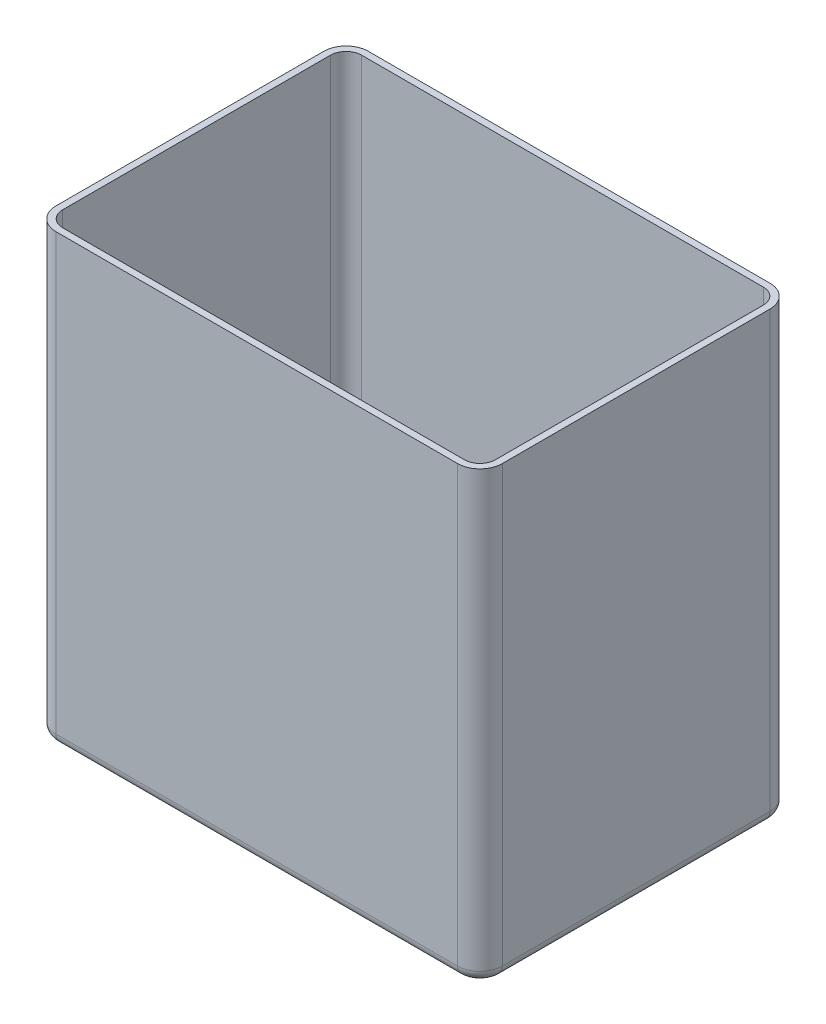
ISO-10303-21;
HEADER;
FILE_DESCRIPTION(('STEP AP214'),'2;1');
FILE_NAME('part.step','',(''),(''),'','','');
FILE_SCHEMA(('AUTOMOTIVE_DESIGN { 1 0 10303 214 1 1 1 1 }'));
ENDSEC;
DATA;
#1=APPLICATION_CONTEXT('core data for automotive mechanical design processes');
#2=APPLICATION_PROTOCOL_DEFINITION('international standard','automotive_design',2000,#1);
#3=PRODUCT_CONTEXT('',#1,'mechanical');
#4=PRODUCT('Part','Part','',(#3));
#5=PRODUCT_RELATED_PRODUCT_CATEGORY('part','',(#4));
#6=PRODUCT_DEFINITION_FORMATION('','',#4);
#7=PRODUCT_DEFINITION_CONTEXT('part definition',#1,'design');
#8=PRODUCT_DEFINITION('design','',#6,#7);
#9=PRODUCT_DEFINITION_SHAPE('','',#8);
#10=(LENGTH_UNIT() NAMED_UNIT(*) SI_UNIT(.MILLI.,.METRE.));
#11=(NAMED_UNIT(*) PLANE_ANGLE_UNIT() SI_UNIT($,.RADIAN.));
#12=(NAMED_UNIT(*) SI_UNIT($,.STERADIAN.) SOLID_ANGLE_UNIT());
#13=UNCERTAINTY_MEASURE_WITH_UNIT(LENGTH_MEASURE(1.E-05),#10,'distance_accuracy_value','');
#14=(GEOMETRIC_REPRESENTATION_CONTEXT(3) GLOBAL_UNCERTAINTY_ASSIGNED_CONTEXT((#13)) GLOBAL_UNIT_ASSIGNED_CONTEXT((#10,
#11,#12)) REPRESENTATION_CONTEXT('',''));
#15=CARTESIAN_POINT('',(0.,0.,0.));
#16=DIRECTION('',(0.,0.,1.));
#17=DIRECTION('',(1.,0.,0.));
#18=AXIS2_PLACEMENT_3D('',#15,#16,#17);
#19=CARTESIAN_POINT('',(-100.,-200.,70.));
#20=DIRECTION('',(-1.,0.,0.));
#21=DIRECTION('',(0.,0.,1.));
#22=AXIS2_PLACEMENT_3D('',#19,#20,#21);
#23=PLANE('',#22);
#24=DIRECTION('',(0.,1.,0.));
#25=VECTOR('',#24,1.);
#26=CARTESIAN_POINT('',(-100.,-200.,-60.));
#27=LINE('',#26,#25);
#28=CARTESIAN_POINT('',(-100.,0.,-60.));
#29=VERTEX_POINT('',#28);
#30=CARTESIAN_POINT('',(-100.,-195.,-60.));
#31=VERTEX_POINT('',#30);
#32=EDGE_CURVE('E321',#29,#31,#27,.F.);
#33=ORIENTED_EDGE('',*,*,#32,.T.);
#34=DIRECTION('',(0.,0.,1.));
#35=VECTOR('',#34,1.);
#36=CARTESIAN_POINT('',(-100.,-195.,60.));
#37=LINE('',#36,#35);
#38=CARTESIAN_POINT('',(-100.,-195.,60.));
#39=VERTEX_POINT('',#38);
#40=EDGE_CURVE('E376',#31,#39,#37,.T.);
#41=ORIENTED_EDGE('',*,*,#40,.T.);
#42=DIRECTION('',(0.,1.,0.));
#43=VECTOR('',#42,1.);
#44=CARTESIAN_POINT('',(-100.,-200.,60.));
#45=LINE('',#44,#43);
#46=CARTESIAN_POINT('',(-100.,0.,60.));
#47=VERTEX_POINT('',#46);
#48=EDGE_CURVE('E324',#39,#47,#45,.T.);
#49=ORIENTED_EDGE('',*,*,#48,.T.);
#50=DIRECTION('',(0.,0.,1.));
#51=VECTOR('',#50,1.);
#52=CARTESIAN_POINT('',(-100.,0.,70.));
#53=LINE('',#52,#51);
#54=EDGE_CURVE('E309',#29,#47,#53,.T.);
#55=ORIENTED_EDGE('',*,*,#54,.F.);
#56=EDGE_LOOP('',(#33,#41,#49,#55));
#57=FACE_BOUND('',#56,.T.);
#58=ADVANCED_FACE('F33',(#57),#23,.T.);
#59=CARTESIAN_POINT('',(100.,-200.,-70.));
#60=DIRECTION('',(0.,0.,-1.));
#61=DIRECTION('',(-1.,0.,0.));
#62=AXIS2_PLACEMENT_3D('',#59,#60,#61);
#63=PLANE('',#62);
#64=DIRECTION('',(0.,1.,0.));
#65=VECTOR('',#64,1.);
#66=CARTESIAN_POINT('',(90.,-200.,-70.));
#67=LINE('',#66,#65);
#68=CARTESIAN_POINT('',(90.,0.,-70.));
#69=VERTEX_POINT('',#68);
#70=CARTESIAN_POINT('',(90.,-195.,-70.));
#71=VERTEX_POINT('',#70);
#72=EDGE_CURVE('E338',#69,#71,#67,.F.);
#73=ORIENTED_EDGE('',*,*,#72,.T.);
#74=DIRECTION('',(-1.,0.,0.));
#75=VECTOR('',#74,1.);
#76=CARTESIAN_POINT('',(-90.,-195.,-70.));
#77=LINE('',#76,#75);
#78=CARTESIAN_POINT('',(-90.,-195.,-70.));
#79=VERTEX_POINT('',#78);
#80=EDGE_CURVE('E372',#71,#79,#77,.T.);
#81=ORIENTED_EDGE('',*,*,#80,.T.);
#82=DIRECTION('',(0.,1.,0.));
#83=VECTOR('',#82,1.);
#84=CARTESIAN_POINT('',(-90.,-200.,-70.));
#85=LINE('',#84,#83);
#86=CARTESIAN_POINT('',(-90.,0.,-70.));
#87=VERTEX_POINT('',#86);
#88=EDGE_CURVE('E341',#79,#87,#85,.T.);
#89=ORIENTED_EDGE('',*,*,#88,.T.);
#90=DIRECTION('',(-1.,0.,0.));
#91=VECTOR('',#90,1.);
#92=CARTESIAN_POINT('',(100.,0.,-70.));
#93=LINE('',#92,#91);
#94=EDGE_CURVE('E318',#69,#87,#93,.T.);
#95=ORIENTED_EDGE('',*,*,#94,.F.);
#96=EDGE_LOOP('',(#73,#81,#89,#95));
#97=FACE_BOUND('',#96,.T.);
#98=ADVANCED_FACE('F424',(#97),#63,.T.);
#99=CARTESIAN_POINT('',(100.,-200.,70.));
#100=DIRECTION('',(1.,0.,0.));
#101=DIRECTION('',(0.,0.,-1.));
#102=AXIS2_PLACEMENT_3D('',#99,#100,#101);
#103=PLANE('',#102);
#104=DIRECTION('',(0.,1.,0.));
#105=VECTOR('',#104,1.);
#106=CARTESIAN_POINT('',(100.,-200.,60.));
#107=LINE('',#106,#105);
#108=CARTESIAN_POINT('',(100.,0.,60.));
#109=VERTEX_POINT('',#108);
#110=CARTESIAN_POINT('',(100.,-195.,60.));
#111=VERTEX_POINT('',#110);
#112=EDGE_CURVE('E345',#109,#111,#107,.F.);
#113=ORIENTED_EDGE('',*,*,#112,.T.);
#114=DIRECTION('',(0.,0.,-1.));
#115=VECTOR('',#114,1.);
#116=CARTESIAN_POINT('',(100.,-195.,-60.));
#117=LINE('',#116,#115);
#118=CARTESIAN_POINT('',(100.,-195.,-60.));
#119=VERTEX_POINT('',#118);
#120=EDGE_CURVE('E368',#111,#119,#117,.T.);
#121=ORIENTED_EDGE('',*,*,#120,.T.);
#122=DIRECTION('',(0.,1.,0.));
#123=VECTOR('',#122,1.);
#124=CARTESIAN_POINT('',(100.,-200.,-60.));
#125=LINE('',#124,#123);
#126=CARTESIAN_POINT('',(100.,0.,-60.));
#127=VERTEX_POINT('',#126);
#128=EDGE_CURVE('E343',#119,#127,#125,.T.);
#129=ORIENTED_EDGE('',*,*,#128,.T.);
#130=DIRECTION('',(0.,0.,-1.));
#131=VECTOR('',#130,1.);
#132=CARTESIAN_POINT('',(100.,0.,70.));
#133=LINE('',#132,#131);
#134=EDGE_CURVE('E315',#109,#127,#133,.T.);
#135=ORIENTED_EDGE('',*,*,#134,.F.);
#136=EDGE_LOOP('',(#113,#121,#129,#135));
#137=FACE_BOUND('',#136,.T.);
#138=ADVANCED_FACE('F477',(#137),#103,.T.);
#139=CARTESIAN_POINT('',(100.,-200.,70.));
#140=DIRECTION('',(0.,0.,1.));
#141=DIRECTION('',(1.,0.,0.));
#142=AXIS2_PLACEMENT_3D('',#139,#140,#141);
#143=PLANE('',#142);
#144=DIRECTION('',(0.,1.,0.));
#145=VECTOR('',#144,1.);
#146=CARTESIAN_POINT('',(-90.,-200.,70.));
#147=LINE('',#146,#145);
#148=CARTESIAN_POINT('',(-90.,0.,70.));
#149=VERTEX_POINT('',#148);
#150=CARTESIAN_POINT('',(-90.,-195.,70.));
#151=VERTEX_POINT('',#150);
#152=EDGE_CURVE('E336',#149,#151,#147,.F.);
#153=ORIENTED_EDGE('',*,*,#152,.T.);
#154=DIRECTION('',(1.,0.,0.));
#155=VECTOR('',#154,1.);
#156=CARTESIAN_POINT('',(90.,-195.,70.));
#157=LINE('',#156,#155);
#158=CARTESIAN_POINT('',(90.,-195.,70.));
#159=VERTEX_POINT('',#158);
#160=EDGE_CURVE('E11',#151,#159,#157,.T.);
#161=ORIENTED_EDGE('',*,*,#160,.T.);
#162=DIRECTION('',(0.,1.,0.));
#163=VECTOR('',#162,1.);
#164=CARTESIAN_POINT('',(90.,-200.,70.));
#165=LINE('',#164,#163);
#166=CARTESIAN_POINT('',(90.,0.,70.));
#167=VERTEX_POINT('',#166);
#168=EDGE_CURVE('E334',#159,#167,#165,.T.);
#169=ORIENTED_EDGE('',*,*,#168,.T.);
#170=DIRECTION('',(1.,0.,0.));
#171=VECTOR('',#170,1.);
#172=CARTESIAN_POINT('',(100.,0.,70.));
#173=LINE('',#172,#171);
#174=EDGE_CURVE('E312',#149,#167,#173,.T.);
#175=ORIENTED_EDGE('',*,*,#174,.F.);
#176=EDGE_LOOP('',(#153,#161,#169,#175));
#177=FACE_BOUND('',#176,.T.);
#178=ADVANCED_FACE('F454',(#177),#143,.T.);
#179=CARTESIAN_POINT('',(-100.,-200.,-70.));
#180=DIRECTION('',(0.,1.,0.));
#181=DIRECTION('',(0.,0.,1.));
#182=AXIS2_PLACEMENT_3D('',#179,#180,#181);
#183=PLANE('',#182);
#184=DIRECTION('',(0.,0.,-1.));
#185=VECTOR('',#184,1.);
#186=CARTESIAN_POINT('',(95.,-200.,60.));
#187=LINE('',#186,#185);
#188=CARTESIAN_POINT('',(95.,-200.,-60.));
#189=VERTEX_POINT('',#188);
#190=CARTESIAN_POINT('',(95.,-200.,60.));
#191=VERTEX_POINT('',#190);
#192=EDGE_CURVE('E360',#189,#191,#187,.F.);
#193=ORIENTED_EDGE('',*,*,#192,.T.);
#194=CARTESIAN_POINT('',(90.,-200.,60.));
#195=DIRECTION('',(0.,1.,0.));
#196=DIRECTION('',(0.,0.,1.));
#197=AXIS2_PLACEMENT_3D('',#194,#195,#196);
#198=CIRCLE('',#197,5.);
#199=CARTESIAN_POINT('',(90.,-200.,65.));
#200=VERTEX_POINT('',#199);
#201=EDGE_CURVE('E362',#191,#200,#198,.F.);
#202=ORIENTED_EDGE('',*,*,#201,.T.);
#203=DIRECTION('',(1.,0.,0.));
#204=VECTOR('',#203,1.);
#205=CARTESIAN_POINT('',(-90.,-200.,65.));
#206=LINE('',#205,#204);
#207=CARTESIAN_POINT('',(-90.,-200.,65.));
#208=VERTEX_POINT('',#207);
#209=EDGE_CURVE('E348',#200,#208,#206,.F.);
#210=ORIENTED_EDGE('',*,*,#209,.T.);
#211=CARTESIAN_POINT('',(-90.,-200.,60.));
#212=DIRECTION('',(0.,1.,0.));
#213=DIRECTION('',(0.,0.,1.));
#214=AXIS2_PLACEMENT_3D('',#211,#212,#213);
#215=CIRCLE('',#214,5.);
#216=CARTESIAN_POINT('',(-95.,-200.,60.));
#217=VERTEX_POINT('',#216);
#218=EDGE_CURVE('E350',#208,#217,#215,.F.);
#219=ORIENTED_EDGE('',*,*,#218,.T.);
#220=DIRECTION('',(0.,0.,1.));
#221=VECTOR('',#220,1.);
#222=CARTESIAN_POINT('',(-95.,-200.,-60.));
#223=LINE('',#222,#221);
#224=CARTESIAN_POINT('',(-95.,-200.,-60.));
#225=VERTEX_POINT('',#224);
#226=EDGE_CURVE('E352',#217,#225,#223,.F.);
#227=ORIENTED_EDGE('',*,*,#226,.T.);
#228=CARTESIAN_POINT('',(-90.,-200.,-60.));
#229=DIRECTION('',(0.,1.,0.));
#230=DIRECTION('',(0.,0.,1.));
#231=AXIS2_PLACEMENT_3D('',#228,#229,#230);
#232=CIRCLE('',#231,5.);
#233=CARTESIAN_POINT('',(-90.,-200.,-65.));
#234=VERTEX_POINT('',#233);
#235=EDGE_CURVE('E354',#225,#234,#232,.F.);
#236=ORIENTED_EDGE('',*,*,#235,.T.);
#237=DIRECTION('',(-1.,0.,0.));
#238=VECTOR('',#237,1.);
#239=CARTESIAN_POINT('',(90.,-200.,-65.));
#240=LINE('',#239,#238);
#241=CARTESIAN_POINT('',(90.,-200.,-65.));
#242=VERTEX_POINT('',#241);
#243=EDGE_CURVE('E356',#234,#242,#240,.F.);
#244=ORIENTED_EDGE('',*,*,#243,.T.);
#245=CARTESIAN_POINT('',(90.,-200.,-60.));
#246=DIRECTION('',(0.,1.,0.));
#247=DIRECTION('',(0.,0.,1.));
#248=AXIS2_PLACEMENT_3D('',#245,#246,#247);
#249=CIRCLE('',#248,5.);
#250=EDGE_CURVE('E358',#242,#189,#249,.F.);
#251=ORIENTED_EDGE('',*,*,#250,.T.);
#252=EDGE_LOOP('',(#193,#202,#210,#219,#227,#236,#244,#251));
#253=FACE_BOUND('',#252,.T.);
#254=ADVANCED_FACE('F440',(#253),#183,.F.);
#255=CARTESIAN_POINT('',(-100.,0.,-70.));
#256=DIRECTION('',(0.,1.,0.));
#257=DIRECTION('',(0.,0.,1.));
#258=AXIS2_PLACEMENT_3D('',#255,#256,#257);
#259=PLANE('',#258);
#260=DIRECTION('',(0.,0.,1.));
#261=VECTOR('',#260,1.);
#262=CARTESIAN_POINT('',(-97.,0.,-70.));
#263=LINE('',#262,#261);
#264=CARTESIAN_POINT('',(-97.,0.,-60.));
#265=VERTEX_POINT('',#264);
#266=CARTESIAN_POINT('',(-97.,0.,60.));
#267=VERTEX_POINT('',#266);
#268=EDGE_CURVE('E215',#265,#267,#263,.T.);
#269=ORIENTED_EDGE('',*,*,#268,.F.);
#270=CARTESIAN_POINT('',(-90.,0.,-60.));
#271=DIRECTION('',(0.,1.,0.));
#272=DIRECTION('',(0.,0.,1.));
#273=AXIS2_PLACEMENT_3D('',#270,#271,#272);
#274=CIRCLE('',#273,7.);
#275=CARTESIAN_POINT('',(-90.,0.,-67.));
#276=VERTEX_POINT('',#275);
#277=EDGE_CURVE('E298',#276,#265,#274,.T.);
#278=ORIENTED_EDGE('',*,*,#277,.F.);
#279=DIRECTION('',(-1.,0.,0.));
#280=VECTOR('',#279,1.);
#281=CARTESIAN_POINT('',(-100.,0.,-67.));
#282=LINE('',#281,#280);
#283=CARTESIAN_POINT('',(90.,0.,-67.));
#284=VERTEX_POINT('',#283);
#285=EDGE_CURVE('E50',#284,#276,#282,.T.);
#286=ORIENTED_EDGE('',*,*,#285,.F.);
#287=CARTESIAN_POINT('',(90.,0.,-60.));
#288=DIRECTION('',(0.,1.,0.));
#289=DIRECTION('',(0.,0.,1.));
#290=AXIS2_PLACEMENT_3D('',#287,#288,#289);
#291=CIRCLE('',#290,7.);
#292=CARTESIAN_POINT('',(97.,0.,-60.));
#293=VERTEX_POINT('',#292);
#294=EDGE_CURVE('E219',#293,#284,#291,.T.);
#295=ORIENTED_EDGE('',*,*,#294,.F.);
#296=DIRECTION('',(0.,0.,-1.));
#297=VECTOR('',#296,1.);
#298=CARTESIAN_POINT('',(97.,0.,-70.));
#299=LINE('',#298,#297);
#300=CARTESIAN_POINT('',(97.,0.,60.));
#301=VERTEX_POINT('',#300);
#302=EDGE_CURVE('E301',#301,#293,#299,.T.);
#303=ORIENTED_EDGE('',*,*,#302,.F.);
#304=CARTESIAN_POINT('',(90.,0.,60.));
#305=DIRECTION('',(0.,1.,0.));
#306=DIRECTION('',(0.,0.,1.));
#307=AXIS2_PLACEMENT_3D('',#304,#305,#306);
#308=CIRCLE('',#307,7.);
#309=CARTESIAN_POINT('',(90.,0.,67.));
#310=VERTEX_POINT('',#309);
#311=EDGE_CURVE('E302',#310,#301,#308,.T.);
#312=ORIENTED_EDGE('',*,*,#311,.F.);
#313=DIRECTION('',(1.,0.,0.));
#314=VECTOR('',#313,1.);
#315=CARTESIAN_POINT('',(-100.,0.,67.));
#316=LINE('',#315,#314);
#317=CARTESIAN_POINT('',(-90.,0.,67.));
#318=VERTEX_POINT('',#317);
#319=EDGE_CURVE('E296',#318,#310,#316,.T.);
#320=ORIENTED_EDGE('',*,*,#319,.F.);
#321=CARTESIAN_POINT('',(-90.,0.,60.));
#322=DIRECTION('',(0.,1.,0.));
#323=DIRECTION('',(0.,0.,1.));
#324=AXIS2_PLACEMENT_3D('',#321,#322,#323);
#325=CIRCLE('',#324,7.);
#326=EDGE_CURVE('E245',#267,#318,#325,.T.);
#327=ORIENTED_EDGE('',*,*,#326,.F.);
#328=EDGE_LOOP('',(#269,#278,#286,#295,#303,#312,#320,#327));
#329=FACE_BOUND('',#328,.T.);
#330=ORIENTED_EDGE('',*,*,#54,.T.);
#331=CARTESIAN_POINT('',(-90.,0.,60.));
#332=DIRECTION('',(0.,1.,0.));
#333=DIRECTION('',(0.,0.,1.));
#334=AXIS2_PLACEMENT_3D('',#331,#332,#333);
#335=CIRCLE('',#334,10.);
#336=EDGE_CURVE('E332',#47,#149,#335,.T.);
#337=ORIENTED_EDGE('',*,*,#336,.T.);
#338=ORIENTED_EDGE('',*,*,#174,.T.);
#339=CARTESIAN_POINT('',(90.,0.,60.));
#340=DIRECTION('',(0.,1.,0.));
#341=DIRECTION('',(0.,0.,1.));
#342=AXIS2_PLACEMENT_3D('',#339,#340,#341);
#343=CIRCLE('',#342,10.);
#344=EDGE_CURVE('E328',#167,#109,#343,.T.);
#345=ORIENTED_EDGE('',*,*,#344,.T.);
#346=ORIENTED_EDGE('',*,*,#134,.T.);
#347=CARTESIAN_POINT('',(90.,0.,-60.));
#348=DIRECTION('',(0.,1.,0.));
#349=DIRECTION('',(0.,0.,1.));
#350=AXIS2_PLACEMENT_3D('',#347,#348,#349);
#351=CIRCLE('',#350,10.);
#352=EDGE_CURVE('E326',#127,#69,#351,.T.);
#353=ORIENTED_EDGE('',*,*,#352,.T.);
#354=ORIENTED_EDGE('',*,*,#94,.T.);
#355=CARTESIAN_POINT('',(-90.,0.,-60.));
#356=DIRECTION('',(0.,1.,0.));
#357=DIRECTION('',(0.,0.,1.));
#358=AXIS2_PLACEMENT_3D('',#355,#356,#357);
#359=CIRCLE('',#358,10.);
#360=EDGE_CURVE('E330',#87,#29,#359,.T.);
#361=ORIENTED_EDGE('',*,*,#360,.T.);
#362=EDGE_LOOP('',(#330,#337,#338,#345,#346,#353,#354,#361));
#363=FACE_BOUND('',#362,.T.);
#364=ADVANCED_FACE('F418',(#329,#363),#259,.T.);
#365=CARTESIAN_POINT('',(-90.,-200.,60.));
#366=DIRECTION('',(0.,1.,0.));
#367=DIRECTION('',(0.,0.,1.));
#368=AXIS2_PLACEMENT_3D('',#365,#366,#367);
#369=CYLINDRICAL_SURFACE('',#368,10.);
#370=ORIENTED_EDGE('',*,*,#48,.F.);
#371=CARTESIAN_POINT('',(-90.,-195.,60.));
#372=DIRECTION('',(0.,1.,0.));
#373=DIRECTION('',(0.,0.,1.));
#374=AXIS2_PLACEMENT_3D('',#371,#372,#373);
#375=CIRCLE('',#374,10.);
#376=EDGE_CURVE('E42',#39,#151,#375,.T.);
#377=ORIENTED_EDGE('',*,*,#376,.T.);
#378=ORIENTED_EDGE('',*,*,#152,.F.);
#379=ORIENTED_EDGE('',*,*,#336,.F.);
#380=EDGE_LOOP('',(#370,#377,#378,#379));
#381=FACE_BOUND('',#380,.T.);
#382=ADVANCED_FACE('F482',(#381),#369,.T.);
#383=CARTESIAN_POINT('',(-90.,-200.,-60.));
#384=DIRECTION('',(0.,1.,0.));
#385=DIRECTION('',(0.,0.,1.));
#386=AXIS2_PLACEMENT_3D('',#383,#384,#385);
#387=CYLINDRICAL_SURFACE('',#386,10.);
#388=ORIENTED_EDGE('',*,*,#88,.F.);
#389=CARTESIAN_POINT('',(-90.,-195.,-60.));
#390=DIRECTION('',(0.,1.,0.));
#391=DIRECTION('',(0.,0.,1.));
#392=AXIS2_PLACEMENT_3D('',#389,#390,#391);
#393=CIRCLE('',#392,10.);
#394=EDGE_CURVE('E374',#79,#31,#393,.T.);
#395=ORIENTED_EDGE('',*,*,#394,.T.);
#396=ORIENTED_EDGE('',*,*,#32,.F.);
#397=ORIENTED_EDGE('',*,*,#360,.F.);
#398=EDGE_LOOP('',(#388,#395,#396,#397));
#399=FACE_BOUND('',#398,.T.);
#400=ADVANCED_FACE('F412',(#399),#387,.T.);
#401=CARTESIAN_POINT('',(90.,-200.,60.));
#402=DIRECTION('',(0.,1.,0.));
#403=DIRECTION('',(0.,0.,1.));
#404=AXIS2_PLACEMENT_3D('',#401,#402,#403);
#405=CYLINDRICAL_SURFACE('',#404,10.);
#406=ORIENTED_EDGE('',*,*,#168,.F.);
#407=CARTESIAN_POINT('',(90.,-195.,60.));
#408=DIRECTION('',(0.,1.,0.));
#409=DIRECTION('',(0.,0.,1.));
#410=AXIS2_PLACEMENT_3D('',#407,#408,#409);
#411=CIRCLE('',#410,10.);
#412=EDGE_CURVE('E365',#159,#111,#411,.T.);
#413=ORIENTED_EDGE('',*,*,#412,.T.);
#414=ORIENTED_EDGE('',*,*,#112,.F.);
#415=ORIENTED_EDGE('',*,*,#344,.F.);
#416=EDGE_LOOP('',(#406,#413,#414,#415));
#417=FACE_BOUND('',#416,.T.);
#418=ADVANCED_FACE('F458',(#417),#405,.T.);
#419=CARTESIAN_POINT('',(90.,-200.,-60.));
#420=DIRECTION('',(0.,1.,0.));
#421=DIRECTION('',(0.,0.,1.));
#422=AXIS2_PLACEMENT_3D('',#419,#420,#421);
#423=CYLINDRICAL_SURFACE('',#422,10.);
#424=ORIENTED_EDGE('',*,*,#128,.F.);
#425=CARTESIAN_POINT('',(90.,-195.,-60.));
#426=DIRECTION('',(0.,1.,0.));
#427=DIRECTION('',(0.,0.,1.));
#428=AXIS2_PLACEMENT_3D('',#425,#426,#427);
#429=CIRCLE('',#428,10.);
#430=EDGE_CURVE('E370',#119,#71,#429,.T.);
#431=ORIENTED_EDGE('',*,*,#430,.T.);
#432=ORIENTED_EDGE('',*,*,#72,.F.);
#433=ORIENTED_EDGE('',*,*,#352,.F.);
#434=EDGE_LOOP('',(#424,#431,#432,#433));
#435=FACE_BOUND('',#434,.T.);
#436=ADVANCED_FACE('F427',(#435),#423,.T.);
#437=CARTESIAN_POINT('',(-90.,-195.,-60.));
#438=DIRECTION('',(0.,1.,0.));
#439=DIRECTION('',(0.,0.,1.));
#440=AXIS2_PLACEMENT_3D('',#437,#438,#439);
#441=DEGENERATE_TOROIDAL_SURFACE('',#440,5.,5.,.T.);
#442=CARTESIAN_POINT('',(-95.,-195.,-60.));
#443=DIRECTION('',(0.,0.,1.));
#444=DIRECTION('',(1.,0.,0.));
#445=AXIS2_PLACEMENT_3D('',#442,#443,#444);
#446=CIRCLE('',#445,5.);
#447=EDGE_CURVE('E393',#31,#225,#446,.T.);
#448=ORIENTED_EDGE('',*,*,#447,.F.);
#449=ORIENTED_EDGE('',*,*,#394,.F.);
#450=CARTESIAN_POINT('',(-90.,-195.,-65.));
#451=DIRECTION('',(1.,0.,0.));
#452=DIRECTION('',(0.,0.,-1.));
#453=AXIS2_PLACEMENT_3D('',#450,#451,#452);
#454=CIRCLE('',#453,5.);
#455=EDGE_CURVE('E37',#234,#79,#454,.T.);
#456=ORIENTED_EDGE('',*,*,#455,.F.);
#457=ORIENTED_EDGE('',*,*,#235,.F.);
#458=EDGE_LOOP('',(#448,#449,#456,#457));
#459=FACE_BOUND('',#458,.T.);
#460=ADVANCED_FACE('F35',(#459),#441,.T.);
#461=CARTESIAN_POINT('',(100.,-195.,-65.));
#462=DIRECTION('',(1.,0.,0.));
#463=DIRECTION('',(0.,0.,-1.));
#464=AXIS2_PLACEMENT_3D('',#461,#462,#463);
#465=CYLINDRICAL_SURFACE('',#464,5.);
#466=ORIENTED_EDGE('',*,*,#455,.T.);
#467=ORIENTED_EDGE('',*,*,#80,.F.);
#468=CARTESIAN_POINT('',(90.,-195.,-65.));
#469=DIRECTION('',(1.,0.,0.));
#470=DIRECTION('',(0.,0.,-1.));
#471=AXIS2_PLACEMENT_3D('',#468,#469,#470);
#472=CIRCLE('',#471,5.);
#473=EDGE_CURVE('E391',#242,#71,#472,.T.);
#474=ORIENTED_EDGE('',*,*,#473,.F.);
#475=ORIENTED_EDGE('',*,*,#243,.F.);
#476=EDGE_LOOP('',(#466,#467,#474,#475));
#477=FACE_BOUND('',#476,.T.);
#478=ADVANCED_FACE('F404',(#477),#465,.T.);
#479=CARTESIAN_POINT('',(-95.,-195.,70.));
#480=DIRECTION('',(0.,0.,-1.));
#481=DIRECTION('',(-1.,0.,0.));
#482=AXIS2_PLACEMENT_3D('',#479,#480,#481);
#483=CYLINDRICAL_SURFACE('',#482,5.);
#484=ORIENTED_EDGE('',*,*,#447,.T.);
#485=ORIENTED_EDGE('',*,*,#226,.F.);
#486=CARTESIAN_POINT('',(-95.,-195.,60.));
#487=DIRECTION('',(0.,0.,1.));
#488=DIRECTION('',(1.,0.,0.));
#489=AXIS2_PLACEMENT_3D('',#486,#487,#488);
#490=CIRCLE('',#489,5.);
#491=EDGE_CURVE('E388',#39,#217,#490,.T.);
#492=ORIENTED_EDGE('',*,*,#491,.F.);
#493=ORIENTED_EDGE('',*,*,#40,.F.);
#494=EDGE_LOOP('',(#484,#485,#492,#493));
#495=FACE_BOUND('',#494,.T.);
#496=ADVANCED_FACE('F443',(#495),#483,.T.);
#497=CARTESIAN_POINT('',(90.,-195.,-60.));
#498=DIRECTION('',(0.,1.,0.));
#499=DIRECTION('',(0.,0.,1.));
#500=AXIS2_PLACEMENT_3D('',#497,#498,#499);
#501=DEGENERATE_TOROIDAL_SURFACE('',#500,5.,5.,.T.);
#502=ORIENTED_EDGE('',*,*,#473,.T.);
#503=ORIENTED_EDGE('',*,*,#430,.F.);
#504=CARTESIAN_POINT('',(95.,-195.,-60.));
#505=DIRECTION('',(0.,0.,1.));
#506=DIRECTION('',(1.,0.,0.));
#507=AXIS2_PLACEMENT_3D('',#504,#505,#506);
#508=CIRCLE('',#507,5.);
#509=EDGE_CURVE('E385',#189,#119,#508,.T.);
#510=ORIENTED_EDGE('',*,*,#509,.F.);
#511=ORIENTED_EDGE('',*,*,#250,.F.);
#512=EDGE_LOOP('',(#502,#503,#510,#511));
#513=FACE_BOUND('',#512,.T.);
#514=ADVANCED_FACE('F431',(#513),#501,.T.);
#515=CARTESIAN_POINT('',(-90.,-195.,60.));
#516=DIRECTION('',(0.,1.,0.));
#517=DIRECTION('',(0.,0.,1.));
#518=AXIS2_PLACEMENT_3D('',#515,#516,#517);
#519=DEGENERATE_TOROIDAL_SURFACE('',#518,5.,5.,.T.);
#520=ORIENTED_EDGE('',*,*,#491,.T.);
#521=ORIENTED_EDGE('',*,*,#218,.F.);
#522=CARTESIAN_POINT('',(-90.,-195.,65.));
#523=DIRECTION('',(1.,0.,0.));
#524=DIRECTION('',(0.,0.,-1.));
#525=AXIS2_PLACEMENT_3D('',#522,#523,#524);
#526=CIRCLE('',#525,5.);
#527=EDGE_CURVE('E382',#151,#208,#526,.T.);
#528=ORIENTED_EDGE('',*,*,#527,.F.);
#529=ORIENTED_EDGE('',*,*,#376,.F.);
#530=EDGE_LOOP('',(#520,#521,#528,#529));
#531=FACE_BOUND('',#530,.T.);
#532=ADVANCED_FACE('F445',(#531),#519,.T.);
#533=CARTESIAN_POINT('',(95.,-195.,70.));
#534=DIRECTION('',(0.,0.,1.));
#535=DIRECTION('',(1.,0.,0.));
#536=AXIS2_PLACEMENT_3D('',#533,#534,#535);
#537=CYLINDRICAL_SURFACE('',#536,5.);
#538=ORIENTED_EDGE('',*,*,#509,.T.);
#539=ORIENTED_EDGE('',*,*,#120,.F.);
#540=CARTESIAN_POINT('',(95.,-195.,60.));
#541=DIRECTION('',(0.,0.,1.));
#542=DIRECTION('',(1.,0.,0.));
#543=AXIS2_PLACEMENT_3D('',#540,#541,#542);
#544=CIRCLE('',#543,5.);
#545=EDGE_CURVE('E380',#191,#111,#544,.T.);
#546=ORIENTED_EDGE('',*,*,#545,.F.);
#547=ORIENTED_EDGE('',*,*,#192,.F.);
#548=EDGE_LOOP('',(#538,#539,#546,#547));
#549=FACE_BOUND('',#548,.T.);
#550=ADVANCED_FACE('F436',(#549),#537,.T.);
#551=CARTESIAN_POINT('',(100.,-195.,65.));
#552=DIRECTION('',(-1.,0.,0.));
#553=DIRECTION('',(0.,0.,1.));
#554=AXIS2_PLACEMENT_3D('',#551,#552,#553);
#555=CYLINDRICAL_SURFACE('',#554,5.);
#556=ORIENTED_EDGE('',*,*,#527,.T.);
#557=ORIENTED_EDGE('',*,*,#209,.F.);
#558=CARTESIAN_POINT('',(90.,-195.,65.));
#559=DIRECTION('',(1.,0.,0.));
#560=DIRECTION('',(0.,0.,-1.));
#561=AXIS2_PLACEMENT_3D('',#558,#559,#560);
#562=CIRCLE('',#561,5.);
#563=EDGE_CURVE('E238',#159,#200,#562,.T.);
#564=ORIENTED_EDGE('',*,*,#563,.F.);
#565=ORIENTED_EDGE('',*,*,#160,.F.);
#566=EDGE_LOOP('',(#556,#557,#564,#565));
#567=FACE_BOUND('',#566,.T.);
#568=ADVANCED_FACE('F451',(#567),#555,.T.);
#569=CARTESIAN_POINT('',(90.,-195.,60.));
#570=DIRECTION('',(0.,1.,0.));
#571=DIRECTION('',(0.,0.,1.));
#572=AXIS2_PLACEMENT_3D('',#569,#570,#571);
#573=DEGENERATE_TOROIDAL_SURFACE('',#572,5.,5.,.T.);
#574=ORIENTED_EDGE('',*,*,#545,.T.);
#575=ORIENTED_EDGE('',*,*,#412,.F.);
#576=ORIENTED_EDGE('',*,*,#563,.T.);
#577=ORIENTED_EDGE('',*,*,#201,.F.);
#578=EDGE_LOOP('',(#574,#575,#576,#577));
#579=FACE_BOUND('',#578,.T.);
#580=ADVANCED_FACE('F461',(#579),#573,.T.);
#581=CARTESIAN_POINT('',(-97.,-200.,70.));
#582=DIRECTION('',(-1.,0.,0.));
#583=DIRECTION('',(0.,0.,1.));
#584=AXIS2_PLACEMENT_3D('',#581,#582,#583);
#585=PLANE('',#584);
#586=DIRECTION('',(0.,1.,0.));
#587=VECTOR('',#586,1.);
#588=CARTESIAN_POINT('',(-97.,-200.,-60.));
#589=LINE('',#588,#587);
#590=CARTESIAN_POINT('',(-97.,-195.,-60.));
#591=VERTEX_POINT('',#590);
#592=EDGE_CURVE('E220',#265,#591,#589,.F.);
#593=ORIENTED_EDGE('',*,*,#592,.F.);
#594=ORIENTED_EDGE('',*,*,#268,.T.);
#595=DIRECTION('',(0.,1.,0.));
#596=VECTOR('',#595,1.);
#597=CARTESIAN_POINT('',(-97.,-200.,60.));
#598=LINE('',#597,#596);
#599=CARTESIAN_POINT('',(-97.,-195.,60.));
#600=VERTEX_POINT('',#599);
#601=EDGE_CURVE('E212',#600,#267,#598,.T.);
#602=ORIENTED_EDGE('',*,*,#601,.F.);
#603=DIRECTION('',(0.,0.,1.));
#604=VECTOR('',#603,1.);
#605=CARTESIAN_POINT('',(-97.,-195.,70.));
#606=LINE('',#605,#604);
#607=EDGE_CURVE('E199',#591,#600,#606,.T.);
#608=ORIENTED_EDGE('',*,*,#607,.F.);
#609=EDGE_LOOP('',(#593,#594,#602,#608));
#610=FACE_BOUND('',#609,.T.);
#611=ADVANCED_FACE('F213',(#610),#585,.F.);
#612=CARTESIAN_POINT('',(100.,-200.,-67.));
#613=DIRECTION('',(0.,0.,-1.));
#614=DIRECTION('',(-1.,0.,0.));
#615=AXIS2_PLACEMENT_3D('',#612,#613,#614);
#616=PLANE('',#615);
#617=DIRECTION('',(0.,1.,0.));
#618=VECTOR('',#617,1.);
#619=CARTESIAN_POINT('',(90.,-200.,-67.));
#620=LINE('',#619,#618);
#621=CARTESIAN_POINT('',(90.,-195.,-67.));
#622=VERTEX_POINT('',#621);
#623=EDGE_CURVE('E241',#284,#622,#620,.F.);
#624=ORIENTED_EDGE('',*,*,#623,.F.);
#625=ORIENTED_EDGE('',*,*,#285,.T.);
#626=DIRECTION('',(0.,1.,0.));
#627=VECTOR('',#626,1.);
#628=CARTESIAN_POINT('',(-90.,-200.,-67.));
#629=LINE('',#628,#627);
#630=CARTESIAN_POINT('',(-90.,-195.,-67.));
#631=VERTEX_POINT('',#630);
#632=EDGE_CURVE('E259',#631,#276,#629,.T.);
#633=ORIENTED_EDGE('',*,*,#632,.F.);
#634=DIRECTION('',(-1.,0.,0.));
#635=VECTOR('',#634,1.);
#636=CARTESIAN_POINT('',(100.,-195.,-67.));
#637=LINE('',#636,#635);
#638=EDGE_CURVE('E261',#622,#631,#637,.T.);
#639=ORIENTED_EDGE('',*,*,#638,.F.);
#640=EDGE_LOOP('',(#624,#625,#633,#639));
#641=FACE_BOUND('',#640,.T.);
#642=ADVANCED_FACE('F468',(#641),#616,.F.);
#643=CARTESIAN_POINT('',(97.,-200.,70.));
#644=DIRECTION('',(1.,0.,0.));
#645=DIRECTION('',(0.,0.,-1.));
#646=AXIS2_PLACEMENT_3D('',#643,#644,#645);
#647=PLANE('',#646);
#648=DIRECTION('',(0.,1.,0.));
#649=VECTOR('',#648,1.);
#650=CARTESIAN_POINT('',(97.,-200.,60.));
#651=LINE('',#650,#649);
#652=CARTESIAN_POINT('',(97.,-195.,60.));
#653=VERTEX_POINT('',#652);
#654=EDGE_CURVE('E251',#301,#653,#651,.F.);
#655=ORIENTED_EDGE('',*,*,#654,.F.);
#656=ORIENTED_EDGE('',*,*,#302,.T.);
#657=DIRECTION('',(0.,1.,0.));
#658=VECTOR('',#657,1.);
#659=CARTESIAN_POINT('',(97.,-200.,-60.));
#660=LINE('',#659,#658);
#661=CARTESIAN_POINT('',(97.,-195.,-60.));
#662=VERTEX_POINT('',#661);
#663=EDGE_CURVE('E255',#662,#293,#660,.T.);
#664=ORIENTED_EDGE('',*,*,#663,.F.);
#665=DIRECTION('',(0.,0.,-1.));
#666=VECTOR('',#665,1.);
#667=CARTESIAN_POINT('',(97.,-195.,70.));
#668=LINE('',#667,#666);
#669=EDGE_CURVE('E249',#653,#662,#668,.T.);
#670=ORIENTED_EDGE('',*,*,#669,.F.);
#671=EDGE_LOOP('',(#655,#656,#664,#670));
#672=FACE_BOUND('',#671,.T.);
#673=ADVANCED_FACE('F545',(#672),#647,.F.);
#674=CARTESIAN_POINT('',(100.,-200.,67.));
#675=DIRECTION('',(0.,0.,1.));
#676=DIRECTION('',(1.,0.,0.));
#677=AXIS2_PLACEMENT_3D('',#674,#675,#676);
#678=PLANE('',#677);
#679=DIRECTION('',(0.,1.,0.));
#680=VECTOR('',#679,1.);
#681=CARTESIAN_POINT('',(-90.,-200.,67.));
#682=LINE('',#681,#680);
#683=CARTESIAN_POINT('',(-90.,-195.,67.));
#684=VERTEX_POINT('',#683);
#685=EDGE_CURVE('E234',#318,#684,#682,.F.);
#686=ORIENTED_EDGE('',*,*,#685,.F.);
#687=ORIENTED_EDGE('',*,*,#319,.T.);
#688=DIRECTION('',(0.,1.,0.));
#689=VECTOR('',#688,1.);
#690=CARTESIAN_POINT('',(90.,-200.,67.));
#691=LINE('',#690,#689);
#692=CARTESIAN_POINT('',(90.,-195.,67.));
#693=VERTEX_POINT('',#692);
#694=EDGE_CURVE('E242',#693,#310,#691,.T.);
#695=ORIENTED_EDGE('',*,*,#694,.F.);
#696=DIRECTION('',(1.,0.,0.));
#697=VECTOR('',#696,1.);
#698=CARTESIAN_POINT('',(100.,-195.,67.));
#699=LINE('',#698,#697);
#700=EDGE_CURVE('E236',#684,#693,#699,.T.);
#701=ORIENTED_EDGE('',*,*,#700,.F.);
#702=EDGE_LOOP('',(#686,#687,#695,#701));
#703=FACE_BOUND('',#702,.T.);
#704=ADVANCED_FACE('F554',(#703),#678,.F.);
#705=CARTESIAN_POINT('',(-100.,-197.,-70.));
#706=DIRECTION('',(0.,1.,0.));
#707=DIRECTION('',(0.,0.,1.));
#708=AXIS2_PLACEMENT_3D('',#705,#706,#707);
#709=PLANE('',#708);
#710=DIRECTION('',(0.,0.,1.));
#711=VECTOR('',#710,1.);
#712=CARTESIAN_POINT('',(95.,-197.,-70.));
#713=LINE('',#712,#711);
#714=CARTESIAN_POINT('',(95.,-197.,-60.));
#715=VERTEX_POINT('',#714);
#716=CARTESIAN_POINT('',(95.,-197.,60.));
#717=VERTEX_POINT('',#716);
#718=EDGE_CURVE('E275',#715,#717,#713,.T.);
#719=ORIENTED_EDGE('',*,*,#718,.F.);
#720=CARTESIAN_POINT('',(90.,-197.,-60.));
#721=DIRECTION('',(0.,1.,0.));
#722=DIRECTION('',(0.,0.,1.));
#723=AXIS2_PLACEMENT_3D('',#720,#721,#722);
#724=CIRCLE('',#723,5.);
#725=CARTESIAN_POINT('',(90.,-197.,-65.));
#726=VERTEX_POINT('',#725);
#727=EDGE_CURVE('E277',#726,#715,#724,.F.);
#728=ORIENTED_EDGE('',*,*,#727,.F.);
#729=DIRECTION('',(1.,0.,0.));
#730=VECTOR('',#729,1.);
#731=CARTESIAN_POINT('',(-100.,-197.,-65.));
#732=LINE('',#731,#730);
#733=CARTESIAN_POINT('',(-90.,-197.,-65.));
#734=VERTEX_POINT('',#733);
#735=EDGE_CURVE('E273',#734,#726,#732,.T.);
#736=ORIENTED_EDGE('',*,*,#735,.F.);
#737=CARTESIAN_POINT('',(-90.,-197.,-60.));
#738=DIRECTION('',(0.,1.,0.));
#739=DIRECTION('',(0.,0.,1.));
#740=AXIS2_PLACEMENT_3D('',#737,#738,#739);
#741=CIRCLE('',#740,5.);
#742=CARTESIAN_POINT('',(-95.,-197.,-60.));
#743=VERTEX_POINT('',#742);
#744=EDGE_CURVE('E271',#743,#734,#741,.F.);
#745=ORIENTED_EDGE('',*,*,#744,.F.);
#746=DIRECTION('',(0.,0.,1.));
#747=VECTOR('',#746,1.);
#748=CARTESIAN_POINT('',(-95.,-197.,-70.));
#749=LINE('',#748,#747);
#750=CARTESIAN_POINT('',(-95.,-197.,60.));
#751=VERTEX_POINT('',#750);
#752=EDGE_CURVE('E274',#751,#743,#749,.F.);
#753=ORIENTED_EDGE('',*,*,#752,.F.);
#754=CARTESIAN_POINT('',(-90.,-197.,60.));
#755=DIRECTION('',(0.,1.,0.));
#756=DIRECTION('',(0.,0.,1.));
#757=AXIS2_PLACEMENT_3D('',#754,#755,#756);
#758=CIRCLE('',#757,5.);
#759=CARTESIAN_POINT('',(-90.,-197.,65.));
#760=VERTEX_POINT('',#759);
#761=EDGE_CURVE('E227',#760,#751,#758,.F.);
#762=ORIENTED_EDGE('',*,*,#761,.F.);
#763=DIRECTION('',(1.,0.,0.));
#764=VECTOR('',#763,1.);
#765=CARTESIAN_POINT('',(-100.,-197.,65.));
#766=LINE('',#765,#764);
#767=CARTESIAN_POINT('',(90.,-197.,65.));
#768=VERTEX_POINT('',#767);
#769=EDGE_CURVE('E254',#768,#760,#766,.F.);
#770=ORIENTED_EDGE('',*,*,#769,.F.);
#771=CARTESIAN_POINT('',(90.,-197.,60.));
#772=DIRECTION('',(0.,1.,0.));
#773=DIRECTION('',(0.,0.,1.));
#774=AXIS2_PLACEMENT_3D('',#771,#772,#773);
#775=CIRCLE('',#774,5.);
#776=EDGE_CURVE('E250',#717,#768,#775,.F.);
#777=ORIENTED_EDGE('',*,*,#776,.F.);
#778=EDGE_LOOP('',(#719,#728,#736,#745,#753,#762,#770,#777));
#779=FACE_BOUND('',#778,.T.);
#780=ADVANCED_FACE('F564',(#779),#709,.T.);
#781=CARTESIAN_POINT('',(-90.,-200.,60.));
#782=DIRECTION('',(0.,1.,0.));
#783=DIRECTION('',(0.,0.,1.));
#784=AXIS2_PLACEMENT_3D('',#781,#782,#783);
#785=CYLINDRICAL_SURFACE('',#784,7.);
#786=ORIENTED_EDGE('',*,*,#601,.T.);
#787=ORIENTED_EDGE('',*,*,#326,.T.);
#788=ORIENTED_EDGE('',*,*,#685,.T.);
#789=CARTESIAN_POINT('',(-90.,-195.,60.));
#790=DIRECTION('',(0.,1.,0.));
#791=DIRECTION('',(0.,0.,1.));
#792=AXIS2_PLACEMENT_3D('',#789,#790,#791);
#793=CIRCLE('',#792,7.);
#794=EDGE_CURVE('E208',#600,#684,#793,.T.);
#795=ORIENTED_EDGE('',*,*,#794,.F.);
#796=EDGE_LOOP('',(#786,#787,#788,#795));
#797=FACE_BOUND('',#796,.T.);
#798=ADVANCED_FACE('F232',(#797),#785,.F.);
#799=CARTESIAN_POINT('',(-90.,-200.,-60.));
#800=DIRECTION('',(0.,1.,0.));
#801=DIRECTION('',(0.,0.,1.));
#802=AXIS2_PLACEMENT_3D('',#799,#800,#801);
#803=CYLINDRICAL_SURFACE('',#802,7.);
#804=ORIENTED_EDGE('',*,*,#632,.T.);
#805=ORIENTED_EDGE('',*,*,#277,.T.);
#806=ORIENTED_EDGE('',*,*,#592,.T.);
#807=CARTESIAN_POINT('',(-90.,-195.,-60.));
#808=DIRECTION('',(0.,1.,0.));
#809=DIRECTION('',(0.,0.,1.));
#810=AXIS2_PLACEMENT_3D('',#807,#808,#809);
#811=CIRCLE('',#810,7.);
#812=EDGE_CURVE('E209',#631,#591,#811,.T.);
#813=ORIENTED_EDGE('',*,*,#812,.F.);
#814=EDGE_LOOP('',(#804,#805,#806,#813));
#815=FACE_BOUND('',#814,.T.);
#816=ADVANCED_FACE('F583',(#815),#803,.F.);
#817=CARTESIAN_POINT('',(90.,-200.,60.));
#818=DIRECTION('',(0.,1.,0.));
#819=DIRECTION('',(0.,0.,1.));
#820=AXIS2_PLACEMENT_3D('',#817,#818,#819);
#821=CYLINDRICAL_SURFACE('',#820,7.);
#822=ORIENTED_EDGE('',*,*,#694,.T.);
#823=ORIENTED_EDGE('',*,*,#311,.T.);
#824=ORIENTED_EDGE('',*,*,#654,.T.);
#825=CARTESIAN_POINT('',(90.,-195.,60.));
#826=DIRECTION('',(0.,1.,0.));
#827=DIRECTION('',(0.,0.,1.));
#828=AXIS2_PLACEMENT_3D('',#825,#826,#827);
#829=CIRCLE('',#828,7.);
#830=EDGE_CURVE('E246',#693,#653,#829,.T.);
#831=ORIENTED_EDGE('',*,*,#830,.F.);
#832=EDGE_LOOP('',(#822,#823,#824,#831));
#833=FACE_BOUND('',#832,.T.);
#834=ADVANCED_FACE('F592',(#833),#821,.F.);
#835=CARTESIAN_POINT('',(90.,-200.,-60.));
#836=DIRECTION('',(0.,1.,0.));
#837=DIRECTION('',(0.,0.,1.));
#838=AXIS2_PLACEMENT_3D('',#835,#836,#837);
#839=CYLINDRICAL_SURFACE('',#838,7.);
#840=ORIENTED_EDGE('',*,*,#663,.T.);
#841=ORIENTED_EDGE('',*,*,#294,.T.);
#842=ORIENTED_EDGE('',*,*,#623,.T.);
#843=CARTESIAN_POINT('',(90.,-195.,-60.));
#844=DIRECTION('',(0.,1.,0.));
#845=DIRECTION('',(0.,0.,1.));
#846=AXIS2_PLACEMENT_3D('',#843,#844,#845);
#847=CIRCLE('',#846,7.);
#848=EDGE_CURVE('E257',#662,#622,#847,.T.);
#849=ORIENTED_EDGE('',*,*,#848,.F.);
#850=EDGE_LOOP('',(#840,#841,#842,#849));
#851=FACE_BOUND('',#850,.T.);
#852=ADVANCED_FACE('F602',(#851),#839,.F.);
#853=CARTESIAN_POINT('',(-90.,-195.,-60.));
#854=DIRECTION('',(0.,1.,0.));
#855=DIRECTION('',(0.,0.,1.));
#856=AXIS2_PLACEMENT_3D('',#853,#854,#855);
#857=TOROIDAL_SURFACE('',#856,5.,2.);
#858=CARTESIAN_POINT('',(-95.,-195.,-60.));
#859=DIRECTION('',(0.,0.,-1.));
#860=DIRECTION('',(-1.,0.,0.));
#861=AXIS2_PLACEMENT_3D('',#858,#859,#860);
#862=CIRCLE('',#861,2.);
#863=EDGE_CURVE('E205',#591,#743,#862,.F.);
#864=ORIENTED_EDGE('',*,*,#863,.T.);
#865=ORIENTED_EDGE('',*,*,#744,.T.);
#866=CARTESIAN_POINT('',(-90.,-195.,-65.));
#867=DIRECTION('',(1.,0.,0.));
#868=DIRECTION('',(0.,0.,-1.));
#869=AXIS2_PLACEMENT_3D('',#866,#867,#868);
#870=CIRCLE('',#869,2.);
#871=EDGE_CURVE('E268',#734,#631,#870,.T.);
#872=ORIENTED_EDGE('',*,*,#871,.T.);
#873=ORIENTED_EDGE('',*,*,#812,.T.);
#874=EDGE_LOOP('',(#864,#865,#872,#873));
#875=FACE_BOUND('',#874,.T.);
#876=ADVANCED_FACE('F612',(#875),#857,.F.);
#877=CARTESIAN_POINT('',(100.,-195.,-65.));
#878=DIRECTION('',(1.,0.,0.));
#879=DIRECTION('',(0.,0.,-1.));
#880=AXIS2_PLACEMENT_3D('',#877,#878,#879);
#881=CYLINDRICAL_SURFACE('',#880,2.);
#882=ORIENTED_EDGE('',*,*,#871,.F.);
#883=ORIENTED_EDGE('',*,*,#735,.T.);
#884=CARTESIAN_POINT('',(90.,-195.,-65.));
#885=DIRECTION('',(1.,0.,0.));
#886=DIRECTION('',(0.,0.,-1.));
#887=AXIS2_PLACEMENT_3D('',#884,#885,#886);
#888=CIRCLE('',#887,2.);
#889=EDGE_CURVE('E229',#726,#622,#888,.T.);
#890=ORIENTED_EDGE('',*,*,#889,.T.);
#891=ORIENTED_EDGE('',*,*,#638,.T.);
#892=EDGE_LOOP('',(#882,#883,#890,#891));
#893=FACE_BOUND('',#892,.T.);
#894=ADVANCED_FACE('F622',(#893),#881,.F.);
#895=CARTESIAN_POINT('',(-95.,-195.,70.));
#896=DIRECTION('',(0.,0.,-1.));
#897=DIRECTION('',(-1.,0.,0.));
#898=AXIS2_PLACEMENT_3D('',#895,#896,#897);
#899=CYLINDRICAL_SURFACE('',#898,2.);
#900=ORIENTED_EDGE('',*,*,#863,.F.);
#901=ORIENTED_EDGE('',*,*,#607,.T.);
#902=CARTESIAN_POINT('',(-95.,-195.,60.));
#903=DIRECTION('',(0.,0.,-1.));
#904=DIRECTION('',(-1.,0.,0.));
#905=AXIS2_PLACEMENT_3D('',#902,#903,#904);
#906=CIRCLE('',#905,2.);
#907=EDGE_CURVE('E203',#600,#751,#906,.F.);
#908=ORIENTED_EDGE('',*,*,#907,.T.);
#909=ORIENTED_EDGE('',*,*,#752,.T.);
#910=EDGE_LOOP('',(#900,#901,#908,#909));
#911=FACE_BOUND('',#910,.T.);
#912=ADVANCED_FACE('F201',(#911),#899,.F.);
#913=CARTESIAN_POINT('',(90.,-195.,-60.));
#914=DIRECTION('',(0.,1.,0.));
#915=DIRECTION('',(0.,0.,1.));
#916=AXIS2_PLACEMENT_3D('',#913,#914,#915);
#917=TOROIDAL_SURFACE('',#916,5.,2.);
#918=ORIENTED_EDGE('',*,*,#889,.F.);
#919=ORIENTED_EDGE('',*,*,#727,.T.);
#920=CARTESIAN_POINT('',(95.,-195.,-60.));
#921=DIRECTION('',(0.,0.,1.));
#922=DIRECTION('',(1.,0.,0.));
#923=AXIS2_PLACEMENT_3D('',#920,#921,#922);
#924=CIRCLE('',#923,2.);
#925=EDGE_CURVE('E230',#715,#662,#924,.T.);
#926=ORIENTED_EDGE('',*,*,#925,.T.);
#927=ORIENTED_EDGE('',*,*,#848,.T.);
#928=EDGE_LOOP('',(#918,#919,#926,#927));
#929=FACE_BOUND('',#928,.T.);
#930=ADVANCED_FACE('F642',(#929),#917,.F.);
#931=CARTESIAN_POINT('',(-90.,-195.,60.));
#932=DIRECTION('',(0.,1.,0.));
#933=DIRECTION('',(0.,0.,1.));
#934=AXIS2_PLACEMENT_3D('',#931,#932,#933);
#935=TOROIDAL_SURFACE('',#934,5.,2.);
#936=ORIENTED_EDGE('',*,*,#907,.F.);
#937=ORIENTED_EDGE('',*,*,#794,.T.);
#938=CARTESIAN_POINT('',(-90.,-195.,65.));
#939=DIRECTION('',(-1.,0.,0.));
#940=DIRECTION('',(0.,0.,1.));
#941=AXIS2_PLACEMENT_3D('',#938,#939,#940);
#942=CIRCLE('',#941,2.);
#943=EDGE_CURVE('E289',#684,#760,#942,.F.);
#944=ORIENTED_EDGE('',*,*,#943,.T.);
#945=ORIENTED_EDGE('',*,*,#761,.T.);
#946=EDGE_LOOP('',(#936,#937,#944,#945));
#947=FACE_BOUND('',#946,.T.);
#948=ADVANCED_FACE('F223',(#947),#935,.F.);
#949=CARTESIAN_POINT('',(95.,-195.,70.));
#950=DIRECTION('',(0.,0.,1.));
#951=DIRECTION('',(1.,0.,0.));
#952=AXIS2_PLACEMENT_3D('',#949,#950,#951);
#953=CYLINDRICAL_SURFACE('',#952,2.);
#954=ORIENTED_EDGE('',*,*,#925,.F.);
#955=ORIENTED_EDGE('',*,*,#718,.T.);
#956=CARTESIAN_POINT('',(95.,-195.,60.));
#957=DIRECTION('',(0.,0.,1.));
#958=DIRECTION('',(1.,0.,0.));
#959=AXIS2_PLACEMENT_3D('',#956,#957,#958);
#960=CIRCLE('',#959,2.);
#961=EDGE_CURVE('E290',#717,#653,#960,.T.);
#962=ORIENTED_EDGE('',*,*,#961,.T.);
#963=ORIENTED_EDGE('',*,*,#669,.T.);
#964=EDGE_LOOP('',(#954,#955,#962,#963));
#965=FACE_BOUND('',#964,.T.);
#966=ADVANCED_FACE('F661',(#965),#953,.F.);
#967=CARTESIAN_POINT('',(100.,-195.,65.));
#968=DIRECTION('',(-1.,0.,0.));
#969=DIRECTION('',(0.,0.,1.));
#970=AXIS2_PLACEMENT_3D('',#967,#968,#969);
#971=CYLINDRICAL_SURFACE('',#970,2.);
#972=ORIENTED_EDGE('',*,*,#943,.F.);
#973=ORIENTED_EDGE('',*,*,#700,.T.);
#974=CARTESIAN_POINT('',(90.,-195.,65.));
#975=DIRECTION('',(-1.,0.,0.));
#976=DIRECTION('',(0.,0.,1.));
#977=AXIS2_PLACEMENT_3D('',#974,#975,#976);
#978=CIRCLE('',#977,2.);
#979=EDGE_CURVE('E292',#693,#768,#978,.F.);
#980=ORIENTED_EDGE('',*,*,#979,.T.);
#981=ORIENTED_EDGE('',*,*,#769,.T.);
#982=EDGE_LOOP('',(#972,#973,#980,#981));
#983=FACE_BOUND('',#982,.T.);
#984=ADVANCED_FACE('F671',(#983),#971,.F.);
#985=CARTESIAN_POINT('',(90.,-195.,60.));
#986=DIRECTION('',(0.,1.,0.));
#987=DIRECTION('',(0.,0.,1.));
#988=AXIS2_PLACEMENT_3D('',#985,#986,#987);
#989=TOROIDAL_SURFACE('',#988,5.,2.);
#990=ORIENTED_EDGE('',*,*,#961,.F.);
#991=ORIENTED_EDGE('',*,*,#776,.T.);
#992=ORIENTED_EDGE('',*,*,#979,.F.);
#993=ORIENTED_EDGE('',*,*,#830,.T.);
#994=EDGE_LOOP('',(#990,#991,#992,#993));
#995=FACE_BOUND('',#994,.T.);
#996=ADVANCED_FACE('F681',(#995),#989,.F.);
#997=CLOSED_SHELL('',(#58,#98,#138,#178,#254,#364,#382,#400,#418,#436,#460,#478,#496,#514,#532,
#550,#568,#580,#611,#642,#673,#704,#780,#798,#816,#834,#852,#876,#894,#912,#930,#948,#966,#984,#996));
#998=MANIFOLD_SOLID_BREP('B2',#997);
#999=ADVANCED_BREP_SHAPE_REPRESENTATION('',(#18,#998),#14);
#1000=SHAPE_DEFINITION_REPRESENTATION(#9,#999);
ENDSEC;
END-ISO-10303-21;
